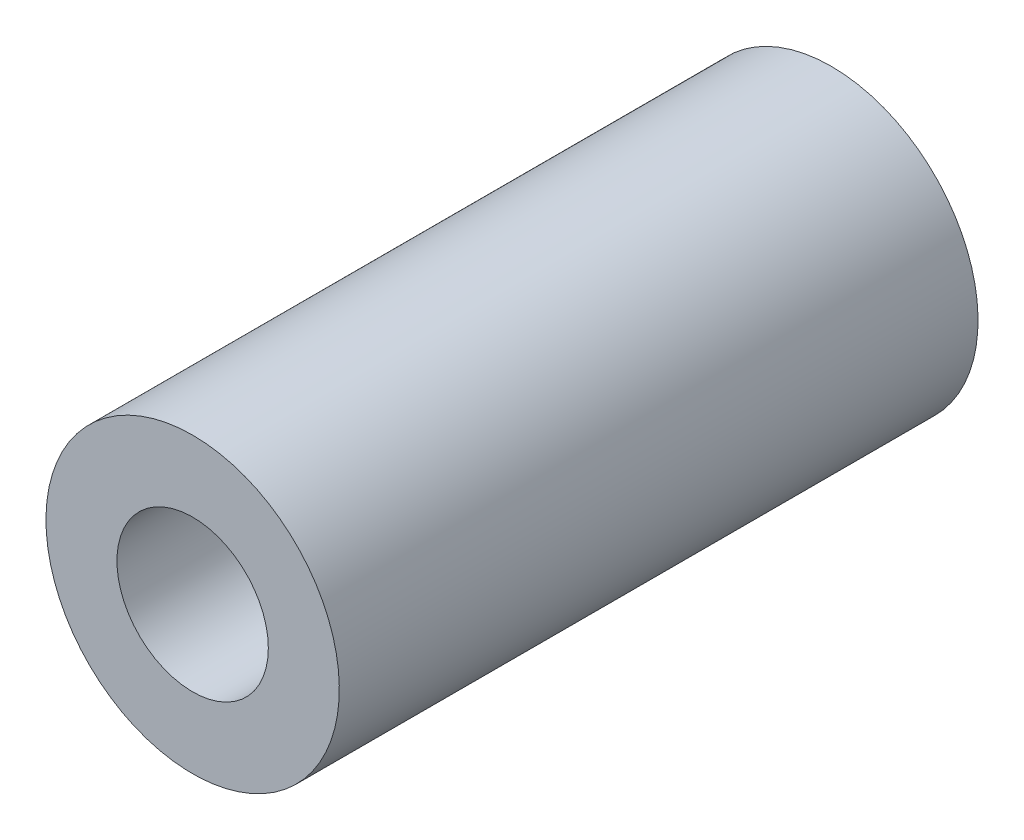
ISO-10303-21;
HEADER;
FILE_DESCRIPTION(('STEP AP214'),'2;1');
FILE_NAME('part.step','',(''),(''),'','','');
FILE_SCHEMA(('AUTOMOTIVE_DESIGN { 1 0 10303 214 1 1 1 1 }'));
ENDSEC;
DATA;
#1=APPLICATION_CONTEXT('core data for automotive mechanical design processes');
#2=APPLICATION_PROTOCOL_DEFINITION('international standard','automotive_design',2000,#1);
#3=PRODUCT_CONTEXT('',#1,'mechanical');
#4=PRODUCT('Part','Part','',(#3));
#5=PRODUCT_RELATED_PRODUCT_CATEGORY('part','',(#4));
#6=PRODUCT_DEFINITION_FORMATION('','',#4);
#7=PRODUCT_DEFINITION_CONTEXT('part definition',#1,'design');
#8=PRODUCT_DEFINITION('design','',#6,#7);
#9=PRODUCT_DEFINITION_SHAPE('','',#8);
#10=(LENGTH_UNIT() NAMED_UNIT(*) SI_UNIT(.MILLI.,.METRE.));
#11=(NAMED_UNIT(*) PLANE_ANGLE_UNIT() SI_UNIT($,.RADIAN.));
#12=(NAMED_UNIT(*) SI_UNIT($,.STERADIAN.) SOLID_ANGLE_UNIT());
#13=UNCERTAINTY_MEASURE_WITH_UNIT(LENGTH_MEASURE(1.E-05),#10,'distance_accuracy_value','');
#14=(GEOMETRIC_REPRESENTATION_CONTEXT(3) GLOBAL_UNCERTAINTY_ASSIGNED_CONTEXT((#13)) GLOBAL_UNIT_ASSIGNED_CONTEXT((#10,
#11,#12)) REPRESENTATION_CONTEXT('',''));
#15=CARTESIAN_POINT('',(0.,0.,0.));
#16=DIRECTION('',(0.,0.,1.));
#17=DIRECTION('',(1.,0.,0.));
#18=AXIS2_PLACEMENT_3D('',#15,#16,#17);
#19=CARTESIAN_POINT('',(0.,0.,13.5));
#20=DIRECTION('',(0.,0.,1.));
#21=DIRECTION('',(1.,0.,0.));
#22=AXIS2_PLACEMENT_3D('',#19,#20,#21);
#23=PLANE('',#22);
#24=CARTESIAN_POINT('',(0.,0.,13.5));
#25=DIRECTION('',(0.,0.,1.));
#26=DIRECTION('',(0.,1.,0.));
#27=AXIS2_PLACEMENT_3D('',#24,#25,#26);
#28=CIRCLE('',#27,3.1);
#29=CARTESIAN_POINT('',(0.,3.1,13.5));
#30=VERTEX_POINT('',#29);
#31=EDGE_CURVE('E11',#30,#30,#28,.T.);
#32=ORIENTED_EDGE('',*,*,#31,.T.);
#33=EDGE_LOOP('',(#32));
#34=FACE_BOUND('',#33,.T.);
#35=CARTESIAN_POINT('',(0.,0.,13.5));
#36=DIRECTION('',(0.,0.,1.));
#37=DIRECTION('',(1.,0.,0.));
#38=AXIS2_PLACEMENT_3D('',#35,#36,#37);
#39=CIRCLE('',#38,1.6);
#40=CARTESIAN_POINT('',(1.6,0.,13.5));
#41=VERTEX_POINT('',#40);
#42=EDGE_CURVE('E54',#41,#41,#39,.T.);
#43=ORIENTED_EDGE('',*,*,#42,.F.);
#44=EDGE_LOOP('',(#43));
#45=FACE_BOUND('',#44,.T.);
#46=ADVANCED_FACE('F43',(#34,#45),#23,.T.);
#47=CARTESIAN_POINT('',(0.,0.,0.));
#48=DIRECTION('',(0.,0.,1.));
#49=DIRECTION('',(1.,0.,0.));
#50=AXIS2_PLACEMENT_3D('',#47,#48,#49);
#51=PLANE('',#50);
#52=CARTESIAN_POINT('',(0.,0.,0.));
#53=DIRECTION('',(0.,0.,1.));
#54=DIRECTION('',(0.,1.,0.));
#55=AXIS2_PLACEMENT_3D('',#52,#53,#54);
#56=CIRCLE('',#55,3.1);
#57=CARTESIAN_POINT('',(0.,3.1,0.));
#58=VERTEX_POINT('',#57);
#59=EDGE_CURVE('E47',#58,#58,#56,.T.);
#60=ORIENTED_EDGE('',*,*,#59,.F.);
#61=EDGE_LOOP('',(#60));
#62=FACE_BOUND('',#61,.T.);
#63=CARTESIAN_POINT('',(0.,0.,0.));
#64=DIRECTION('',(0.,0.,1.));
#65=DIRECTION('',(1.,0.,0.));
#66=AXIS2_PLACEMENT_3D('',#63,#64,#65);
#67=CIRCLE('',#66,1.6);
#68=CARTESIAN_POINT('',(1.6,0.,0.));
#69=VERTEX_POINT('',#68);
#70=EDGE_CURVE('E56',#69,#69,#67,.T.);
#71=ORIENTED_EDGE('',*,*,#70,.T.);
#72=EDGE_LOOP('',(#71));
#73=FACE_BOUND('',#72,.T.);
#74=ADVANCED_FACE('F66',(#62,#73),#51,.F.);
#75=CARTESIAN_POINT('',(0.,0.,13.5));
#76=DIRECTION('',(0.,0.,-1.));
#77=DIRECTION('',(-1.,0.,0.));
#78=AXIS2_PLACEMENT_3D('',#75,#76,#77);
#79=CYLINDRICAL_SURFACE('',#78,3.1);
#80=ORIENTED_EDGE('',*,*,#31,.F.);
#81=EDGE_LOOP('',(#80));
#82=FACE_BOUND('',#81,.T.);
#83=ORIENTED_EDGE('',*,*,#59,.T.);
#84=EDGE_LOOP('',(#83));
#85=FACE_BOUND('',#84,.T.);
#86=ADVANCED_FACE('F45',(#82,#85),#79,.T.);
#87=CARTESIAN_POINT('',(0.,0.,13.5));
#88=DIRECTION('',(0.,0.,-1.));
#89=DIRECTION('',(-1.,0.,0.));
#90=AXIS2_PLACEMENT_3D('',#87,#88,#89);
#91=CYLINDRICAL_SURFACE('',#90,1.6);
#92=ORIENTED_EDGE('',*,*,#42,.T.);
#93=EDGE_LOOP('',(#92));
#94=FACE_BOUND('',#93,.T.);
#95=ORIENTED_EDGE('',*,*,#70,.F.);
#96=EDGE_LOOP('',(#95));
#97=FACE_BOUND('',#96,.T.);
#98=ADVANCED_FACE('F62',(#94,#97),#91,.F.);
#99=CLOSED_SHELL('',(#46,#74,#86,#98));
#100=MANIFOLD_SOLID_BREP('B2',#99);
#101=ADVANCED_BREP_SHAPE_REPRESENTATION('',(#18,#100),#14);
#102=SHAPE_DEFINITION_REPRESENTATION(#9,#101);
ENDSEC;
END-ISO-10303-21;
